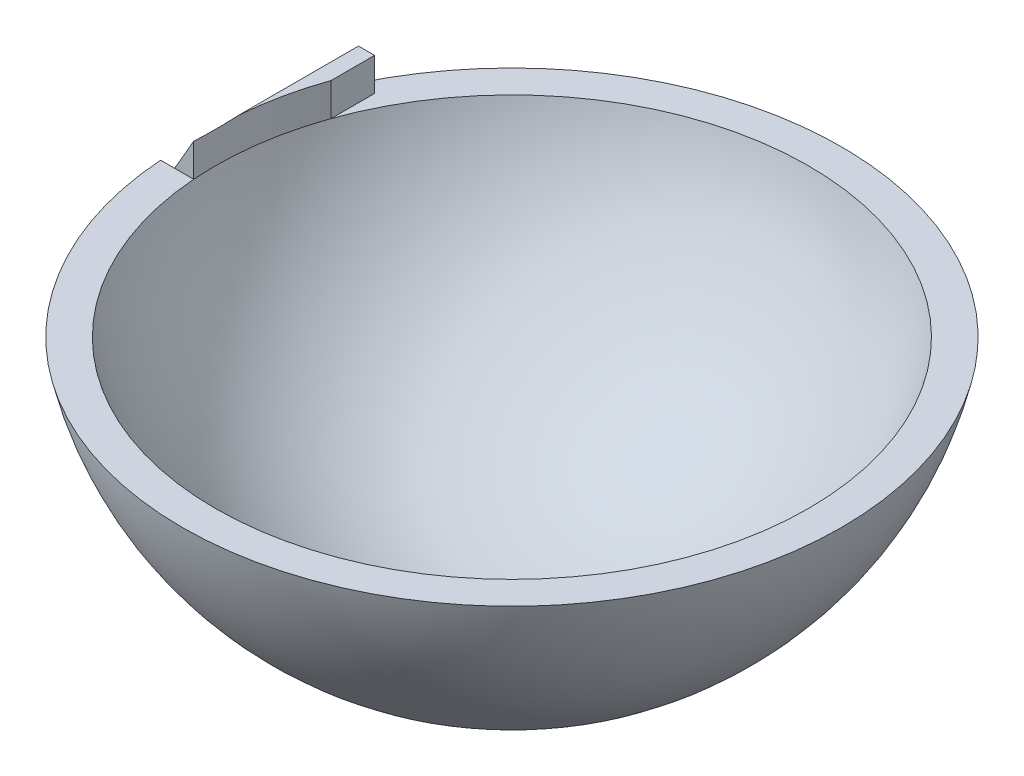
ISO-10303-21;
HEADER;
FILE_DESCRIPTION(('STEP AP214'),'2;1');
FILE_NAME('part.step','',(''),(''),'','','');
FILE_SCHEMA(('AUTOMOTIVE_DESIGN { 1 0 10303 214 1 1 1 1 }'));
ENDSEC;
DATA;
#1=APPLICATION_CONTEXT('core data for automotive mechanical design processes');
#2=APPLICATION_PROTOCOL_DEFINITION('international standard','automotive_design',2000,#1);
#3=PRODUCT_CONTEXT('',#1,'mechanical');
#4=PRODUCT('Part','Part','',(#3));
#5=PRODUCT_RELATED_PRODUCT_CATEGORY('part','',(#4));
#6=PRODUCT_DEFINITION_FORMATION('','',#4);
#7=PRODUCT_DEFINITION_CONTEXT('part definition',#1,'design');
#8=PRODUCT_DEFINITION('design','',#6,#7);
#9=PRODUCT_DEFINITION_SHAPE('','',#8);
#10=(LENGTH_UNIT() NAMED_UNIT(*) SI_UNIT(.MILLI.,.METRE.));
#11=(NAMED_UNIT(*) PLANE_ANGLE_UNIT() SI_UNIT($,.RADIAN.));
#12=(NAMED_UNIT(*) SI_UNIT($,.STERADIAN.) SOLID_ANGLE_UNIT());
#13=UNCERTAINTY_MEASURE_WITH_UNIT(LENGTH_MEASURE(1.E-05),#10,'distance_accuracy_value','');
#14=(GEOMETRIC_REPRESENTATION_CONTEXT(3) GLOBAL_UNCERTAINTY_ASSIGNED_CONTEXT((#13)) GLOBAL_UNIT_ASSIGNED_CONTEXT((#10,
#11,#12)) REPRESENTATION_CONTEXT('',''));
#15=CARTESIAN_POINT('',(0.,0.,0.));
#16=DIRECTION('',(0.,0.,1.));
#17=DIRECTION('',(1.,0.,0.));
#18=AXIS2_PLACEMENT_3D('',#15,#16,#17);
#19=CARTESIAN_POINT('',(0.,0.,0.));
#20=DIRECTION('',(0.,1.,0.));
#21=DIRECTION('',(-1.,0.,0.));
#22=AXIS2_PLACEMENT_3D('',#19,#20,#21);
#23=PLANE('',#22);
#24=DIRECTION('',(-1.,0.,0.));
#25=VECTOR('',#24,1.);
#26=CARTESIAN_POINT('',(0.,0.,4.31800000000001));
#27=LINE('',#26,#25);
#28=CARTESIAN_POINT('',(-56.986642083913,0.,4.31800000000001));
#29=VERTEX_POINT('',#28);
#30=CARTESIAN_POINT('',(-60.6528162932671,0.,4.31800000000001));
#31=VERTEX_POINT('',#30);
#32=EDGE_CURVE('E133',#29,#31,#27,.T.);
#33=ORIENTED_EDGE('',*,*,#32,.T.);
#34=DIRECTION('',(-1.,0.,0.));
#35=VECTOR('',#34,1.);
#36=CARTESIAN_POINT('',(0.,0.,4.31800000000001));
#37=LINE('',#36,#35);
#38=CARTESIAN_POINT('',(-63.35301789181,0.,4.31800000000001));
#39=VERTEX_POINT('',#38);
#40=EDGE_CURVE('E196',#31,#39,#37,.T.);
#41=ORIENTED_EDGE('',*,*,#40,.T.);
#42=CARTESIAN_POINT('',(0.,0.,0.));
#43=DIRECTION('',(0.,1.,0.));
#44=DIRECTION('',(-1.,0.,0.));
#45=AXIS2_PLACEMENT_3D('',#42,#43,#44);
#46=CIRCLE('',#45,63.5);
#47=CARTESIAN_POINT('',(-57.2689739387742,0.,-27.432));
#48=VERTEX_POINT('',#47);
#49=EDGE_CURVE('E168',#39,#48,#46,.T.);
#50=ORIENTED_EDGE('',*,*,#49,.T.);
#51=DIRECTION('',(-1.,0.,0.));
#52=VECTOR('',#51,1.);
#53=CARTESIAN_POINT('',(0.,0.,-27.432));
#54=LINE('',#53,#52);
#55=CARTESIAN_POINT('',(-53.8815367264149,0.,-27.432));
#56=VERTEX_POINT('',#55);
#57=EDGE_CURVE('E65',#56,#48,#54,.T.);
#58=ORIENTED_EDGE('',*,*,#57,.F.);
#59=DIRECTION('',(0.,0.,-1.));
#60=VECTOR('',#59,1.);
#61=CARTESIAN_POINT('',(-53.8815367264149,0.,0.));
#62=LINE('',#61,#60);
#63=CARTESIAN_POINT('',(-53.8815367264149,0.,-19.05));
#64=VERTEX_POINT('',#63);
#65=EDGE_CURVE('E148',#64,#56,#62,.T.);
#66=ORIENTED_EDGE('',*,*,#65,.F.);
#67=CARTESIAN_POINT('',(0.,0.,0.));
#68=DIRECTION('',(0.,1.,0.));
#69=DIRECTION('',(-1.,0.,0.));
#70=AXIS2_PLACEMENT_3D('',#67,#68,#69);
#71=CIRCLE('',#70,57.15);
#72=EDGE_CURVE('E171',#29,#64,#71,.T.);
#73=ORIENTED_EDGE('',*,*,#72,.F.);
#74=EDGE_LOOP('',(#33,#41,#50,#58,#66,#73));
#75=FACE_BOUND('',#74,.T.);
#76=ADVANCED_FACE('F42',(#75),#23,.T.);
#77=CARTESIAN_POINT('',(0.,14.0986265588136,0.));
#78=DIRECTION('',(0.,1.,0.));
#79=DIRECTION('',(1.,0.,0.));
#80=AXIS2_PLACEMENT_3D('',#77,#78,#79);
#81=SPHERICAL_SURFACE('',#80,65.0463009774183);
#82=ORIENTED_EDGE('',*,*,#49,.F.);
#83=CARTESIAN_POINT('',(0.,14.0986265588136,4.31800000000001));
#84=DIRECTION('',(0.,0.,-1.));
#85=DIRECTION('',(-1.,0.,0.));
#86=AXIS2_PLACEMENT_3D('',#83,#84,#85);
#87=CIRCLE('',#86,64.9028207926658);
#88=CARTESIAN_POINT('',(-60.6528162932671,-9.00141721906871,4.31800000000001));
#89=VERTEX_POINT('',#88);
#90=EDGE_CURVE('E12',#39,#89,#87,.F.);
#91=ORIENTED_EDGE('',*,*,#90,.T.);
#92=CARTESIAN_POINT('',(-60.6528162932671,14.0986265588136,0.));
#93=DIRECTION('',(1.,0.,0.));
#94=DIRECTION('',(0.,1.,0.));
#95=AXIS2_PLACEMENT_3D('',#92,#93,#94);
#96=CIRCLE('',#95,23.5001520535523);
#97=CARTESIAN_POINT('',(-60.6528162932671,0.,-18.8012200586875));
#98=VERTEX_POINT('',#97);
#99=EDGE_CURVE('E104',#98,#89,#96,.F.);
#100=ORIENTED_EDGE('',*,*,#99,.F.);
#101=CARTESIAN_POINT('',(0.,0.,0.));
#102=DIRECTION('',(0.,1.,0.));
#103=DIRECTION('',(-1.,0.,0.));
#104=AXIS2_PLACEMENT_3D('',#101,#102,#103);
#105=CIRCLE('',#104,63.5);
#106=EDGE_CURVE('E118',#48,#98,#105,.T.);
#107=ORIENTED_EDGE('',*,*,#106,.F.);
#108=EDGE_LOOP('',(#82,#91,#100,#107));
#109=FACE_BOUND('',#108,.T.);
#110=ADVANCED_FACE('F116',(#109),#81,.T.);
#111=CARTESIAN_POINT('',(0.,6.35,0.));
#112=DIRECTION('',(0.,-1.,0.));
#113=DIRECTION('',(1.,0.,0.));
#114=AXIS2_PLACEMENT_3D('',#111,#112,#113);
#115=CYLINDRICAL_SURFACE('',#114,63.5);
#116=CARTESIAN_POINT('',(0.,105.05375944208,0.));
#117=DIRECTION('',(-0.866025403784438,0.500000000000001,0.));
#118=DIRECTION('',(-0.500000000000001,-0.866025403784438,0.));
#119=AXIS2_PLACEMENT_3D('',#116,#117,#118);
#120=ELLIPSE('',#119,127.,63.5);
#121=CARTESIAN_POINT('',(-57.2689739387742,5.86098688278516,-27.432));
#122=VERTEX_POINT('',#121);
#123=EDGE_CURVE('E122',#122,#98,#120,.T.);
#124=ORIENTED_EDGE('',*,*,#123,.F.);
#125=DIRECTION('',(0.,-1.,0.));
#126=VECTOR('',#125,1.);
#127=CARTESIAN_POINT('',(-57.2689739387742,6.34999999999999,-27.432));
#128=LINE('',#127,#126);
#129=EDGE_CURVE('E131',#122,#48,#128,.T.);
#130=ORIENTED_EDGE('',*,*,#129,.T.);
#131=ORIENTED_EDGE('',*,*,#106,.T.);
#132=EDGE_LOOP('',(#124,#130,#131));
#133=FACE_BOUND('',#132,.T.);
#134=ADVANCED_FACE('F130',(#133),#115,.T.);
#135=CARTESIAN_POINT('',(0.,6.35,4.31800000000001));
#136=DIRECTION('',(0.,0.,1.));
#137=DIRECTION('',(1.,0.,0.));
#138=AXIS2_PLACEMENT_3D('',#135,#136,#137);
#139=PLANE('',#138);
#140=DIRECTION('',(0.,-1.,0.));
#141=VECTOR('',#140,1.);
#142=CARTESIAN_POINT('',(-56.986642083913,6.34999999999999,4.31800000000001));
#143=LINE('',#142,#141);
#144=CARTESIAN_POINT('',(-56.986642083913,6.34999999999999,4.31800000000001));
#145=VERTEX_POINT('',#144);
#146=EDGE_CURVE('E164',#145,#29,#143,.T.);
#147=ORIENTED_EDGE('',*,*,#146,.F.);
#148=DIRECTION('',(-0.500000000000001,-0.866025403784438,0.));
#149=VECTOR('',#148,1.);
#150=CARTESIAN_POINT('',(-45.4896122199503,26.26343986052,4.31800000000001));
#151=LINE('',#150,#149);
#152=EDGE_CURVE('E111',#145,#31,#151,.T.);
#153=ORIENTED_EDGE('',*,*,#152,.T.);
#154=ORIENTED_EDGE('',*,*,#32,.F.);
#155=EDGE_LOOP('',(#147,#153,#154));
#156=FACE_BOUND('',#155,.T.);
#157=ADVANCED_FACE('F222',(#156),#139,.T.);
#158=CARTESIAN_POINT('',(0.,6.35,0.));
#159=DIRECTION('',(0.,-1.,0.));
#160=DIRECTION('',(1.,0.,0.));
#161=AXIS2_PLACEMENT_3D('',#158,#159,#160);
#162=CYLINDRICAL_SURFACE('',#161,57.15);
#163=CARTESIAN_POINT('',(0.,105.05375944208,0.));
#164=DIRECTION('',(-0.866025403784438,0.500000000000001,0.));
#165=DIRECTION('',(-0.500000000000001,-0.866025403784438,0.));
#166=AXIS2_PLACEMENT_3D('',#163,#164,#165);
#167=ELLIPSE('',#166,114.3,57.15);
#168=CARTESIAN_POINT('',(-56.986642083913,6.34999999999999,-4.31799999999988));
#169=VERTEX_POINT('',#168);
#170=EDGE_CURVE('E57',#145,#169,#167,.F.);
#171=ORIENTED_EDGE('',*,*,#170,.F.);
#172=ORIENTED_EDGE('',*,*,#146,.T.);
#173=CARTESIAN_POINT('',(0.,0.,0.));
#174=DIRECTION('',(0.,1.,0.));
#175=DIRECTION('',(-1.,0.,0.));
#176=AXIS2_PLACEMENT_3D('',#173,#174,#175);
#177=CIRCLE('',#176,57.15);
#178=EDGE_CURVE('E138',#29,#64,#177,.F.);
#179=ORIENTED_EDGE('',*,*,#178,.T.);
#180=DIRECTION('',(0.,-1.,0.));
#181=VECTOR('',#180,1.);
#182=CARTESIAN_POINT('',(-53.8815367264149,6.34999999999999,-19.05));
#183=LINE('',#182,#181);
#184=CARTESIAN_POINT('',(-53.8815367264149,6.34999999999999,-19.05));
#185=VERTEX_POINT('',#184);
#186=EDGE_CURVE('E160',#185,#64,#183,.T.);
#187=ORIENTED_EDGE('',*,*,#186,.F.);
#188=CARTESIAN_POINT('',(0.,6.35,0.));
#189=DIRECTION('',(0.,1.,0.));
#190=DIRECTION('',(-1.,0.,0.));
#191=AXIS2_PLACEMENT_3D('',#188,#189,#190);
#192=CIRCLE('',#191,57.15);
#193=EDGE_CURVE('E153',#169,#185,#192,.F.);
#194=ORIENTED_EDGE('',*,*,#193,.F.);
#195=EDGE_LOOP('',(#171,#172,#179,#187,#194));
#196=FACE_BOUND('',#195,.T.);
#197=ADVANCED_FACE('F182',(#196),#162,.F.);
#198=CARTESIAN_POINT('',(0.,6.35,-27.432));
#199=DIRECTION('',(0.,0.,1.));
#200=DIRECTION('',(1.,0.,0.));
#201=AXIS2_PLACEMENT_3D('',#198,#199,#200);
#202=PLANE('',#201);
#203=DIRECTION('',(-0.500000000000001,-0.866025403784438,0.));
#204=VECTOR('',#203,1.);
#205=CARTESIAN_POINT('',(-42.7399815629347,31.02593986052,-27.432));
#206=LINE('',#205,#204);
#207=CARTESIAN_POINT('',(-56.986642083913,6.34999999999999,-27.432));
#208=VERTEX_POINT('',#207);
#209=EDGE_CURVE('E110',#208,#122,#206,.T.);
#210=ORIENTED_EDGE('',*,*,#209,.F.);
#211=DIRECTION('',(-1.,0.,0.));
#212=VECTOR('',#211,1.);
#213=CARTESIAN_POINT('',(0.,6.35,-27.432));
#214=LINE('',#213,#212);
#215=CARTESIAN_POINT('',(-53.8815367264149,6.34999999999999,-27.432));
#216=VERTEX_POINT('',#215);
#217=EDGE_CURVE('E142',#216,#208,#214,.T.);
#218=ORIENTED_EDGE('',*,*,#217,.F.);
#219=DIRECTION('',(0.,-1.,0.));
#220=VECTOR('',#219,1.);
#221=CARTESIAN_POINT('',(-53.8815367264149,6.34999999999999,-27.432));
#222=LINE('',#221,#220);
#223=EDGE_CURVE('E156',#216,#56,#222,.T.);
#224=ORIENTED_EDGE('',*,*,#223,.T.);
#225=ORIENTED_EDGE('',*,*,#57,.T.);
#226=ORIENTED_EDGE('',*,*,#129,.F.);
#227=EDGE_LOOP('',(#210,#218,#224,#225,#226));
#228=FACE_BOUND('',#227,.T.);
#229=ADVANCED_FACE('F235',(#228),#202,.F.);
#230=CARTESIAN_POINT('',(0.,6.35,0.));
#231=DIRECTION('',(0.,1.,0.));
#232=DIRECTION('',(-1.,0.,0.));
#233=AXIS2_PLACEMENT_3D('',#230,#231,#232);
#234=PLANE('',#233);
#235=ORIENTED_EDGE('',*,*,#217,.T.);
#236=DIRECTION('',(0.,0.,1.));
#237=VECTOR('',#236,1.);
#238=CARTESIAN_POINT('',(-56.986642083913,6.34999999999999,0.));
#239=LINE('',#238,#237);
#240=EDGE_CURVE('E50',#208,#169,#239,.T.);
#241=ORIENTED_EDGE('',*,*,#240,.T.);
#242=ORIENTED_EDGE('',*,*,#193,.T.);
#243=DIRECTION('',(0.,0.,-1.));
#244=VECTOR('',#243,1.);
#245=CARTESIAN_POINT('',(-53.8815367264149,6.34999999999999,0.));
#246=LINE('',#245,#244);
#247=EDGE_CURVE('E186',#185,#216,#246,.T.);
#248=ORIENTED_EDGE('',*,*,#247,.T.);
#249=EDGE_LOOP('',(#235,#241,#242,#248));
#250=FACE_BOUND('',#249,.T.);
#251=ADVANCED_FACE('F178',(#250),#234,.T.);
#252=CARTESIAN_POINT('',(0.,14.2904350353039,0.));
#253=DIRECTION('',(0.,1.,0.));
#254=DIRECTION('',(1.,0.,0.));
#255=AXIS2_PLACEMENT_3D('',#252,#253,#254);
#256=SPHERICAL_SURFACE('',#255,58.9095835454491);
#257=ORIENTED_EDGE('',*,*,#72,.T.);
#258=ORIENTED_EDGE('',*,*,#178,.F.);
#259=EDGE_LOOP('',(#257,#258));
#260=FACE_BOUND('',#259,.T.);
#261=ADVANCED_FACE('F225',(#260),#256,.F.);
#262=CARTESIAN_POINT('',(-53.8815367264149,6.34999999999999,0.));
#263=DIRECTION('',(-1.,0.,0.));
#264=DIRECTION('',(0.,-1.,0.));
#265=AXIS2_PLACEMENT_3D('',#262,#263,#264);
#266=PLANE('',#265);
#267=ORIENTED_EDGE('',*,*,#65,.T.);
#268=ORIENTED_EDGE('',*,*,#223,.F.);
#269=ORIENTED_EDGE('',*,*,#247,.F.);
#270=ORIENTED_EDGE('',*,*,#186,.T.);
#271=EDGE_LOOP('',(#267,#268,#269,#270));
#272=FACE_BOUND('',#271,.T.);
#273=ADVANCED_FACE('F210',(#272),#266,.F.);
#274=CARTESIAN_POINT('',(-45.4896122199503,26.26343986052,-28.702));
#275=DIRECTION('',(-0.866025403784438,0.500000000000001,0.));
#276=DIRECTION('',(-0.500000000000001,-0.866025403784438,0.));
#277=AXIS2_PLACEMENT_3D('',#274,#275,#276);
#278=PLANE('',#277);
#279=ORIENTED_EDGE('',*,*,#170,.T.);
#280=ORIENTED_EDGE('',*,*,#240,.F.);
#281=ORIENTED_EDGE('',*,*,#209,.T.);
#282=ORIENTED_EDGE('',*,*,#123,.T.);
#283=DIRECTION('',(0.,0.,1.));
#284=VECTOR('',#283,1.);
#285=CARTESIAN_POINT('',(-60.6528162932671,0.,-28.702));
#286=LINE('',#285,#284);
#287=EDGE_CURVE('E101',#98,#31,#286,.T.);
#288=ORIENTED_EDGE('',*,*,#287,.T.);
#289=ORIENTED_EDGE('',*,*,#152,.F.);
#290=EDGE_LOOP('',(#279,#280,#281,#282,#288,#289));
#291=FACE_BOUND('',#290,.T.);
#292=ADVANCED_FACE('F123',(#291),#278,.T.);
#293=CARTESIAN_POINT('',(0.,-10.16,4.31800000000001));
#294=DIRECTION('',(0.,0.,-1.));
#295=DIRECTION('',(-1.,0.,0.));
#296=AXIS2_PLACEMENT_3D('',#293,#294,#295);
#297=PLANE('',#296);
#298=ORIENTED_EDGE('',*,*,#40,.F.);
#299=DIRECTION('',(0.,1.,0.));
#300=VECTOR('',#299,1.);
#301=CARTESIAN_POINT('',(-60.6528162932671,-10.16,4.31800000000001));
#302=LINE('',#301,#300);
#303=EDGE_CURVE('E106',#89,#31,#302,.T.);
#304=ORIENTED_EDGE('',*,*,#303,.F.);
#305=ORIENTED_EDGE('',*,*,#90,.F.);
#306=EDGE_LOOP('',(#298,#304,#305));
#307=FACE_BOUND('',#306,.T.);
#308=ADVANCED_FACE('F202',(#307),#297,.T.);
#309=CARTESIAN_POINT('',(-60.6528162932671,-10.16,0.));
#310=DIRECTION('',(1.,0.,0.));
#311=DIRECTION('',(0.,1.,0.));
#312=AXIS2_PLACEMENT_3D('',#309,#310,#311);
#313=PLANE('',#312);
#314=ORIENTED_EDGE('',*,*,#99,.T.);
#315=ORIENTED_EDGE('',*,*,#303,.T.);
#316=ORIENTED_EDGE('',*,*,#287,.F.);
#317=EDGE_LOOP('',(#314,#315,#316));
#318=FACE_BOUND('',#317,.T.);
#319=ADVANCED_FACE('F103',(#318),#313,.F.);
#320=CLOSED_SHELL('',(#76,#110,#134,#157,#197,#229,#251,#261,#273,#292,#308,#319));
#321=MANIFOLD_SOLID_BREP('B2',#320);
#322=ADVANCED_BREP_SHAPE_REPRESENTATION('',(#18,#321),#14);
#323=SHAPE_DEFINITION_REPRESENTATION(#9,#322);
ENDSEC;
END-ISO-10303-21;
